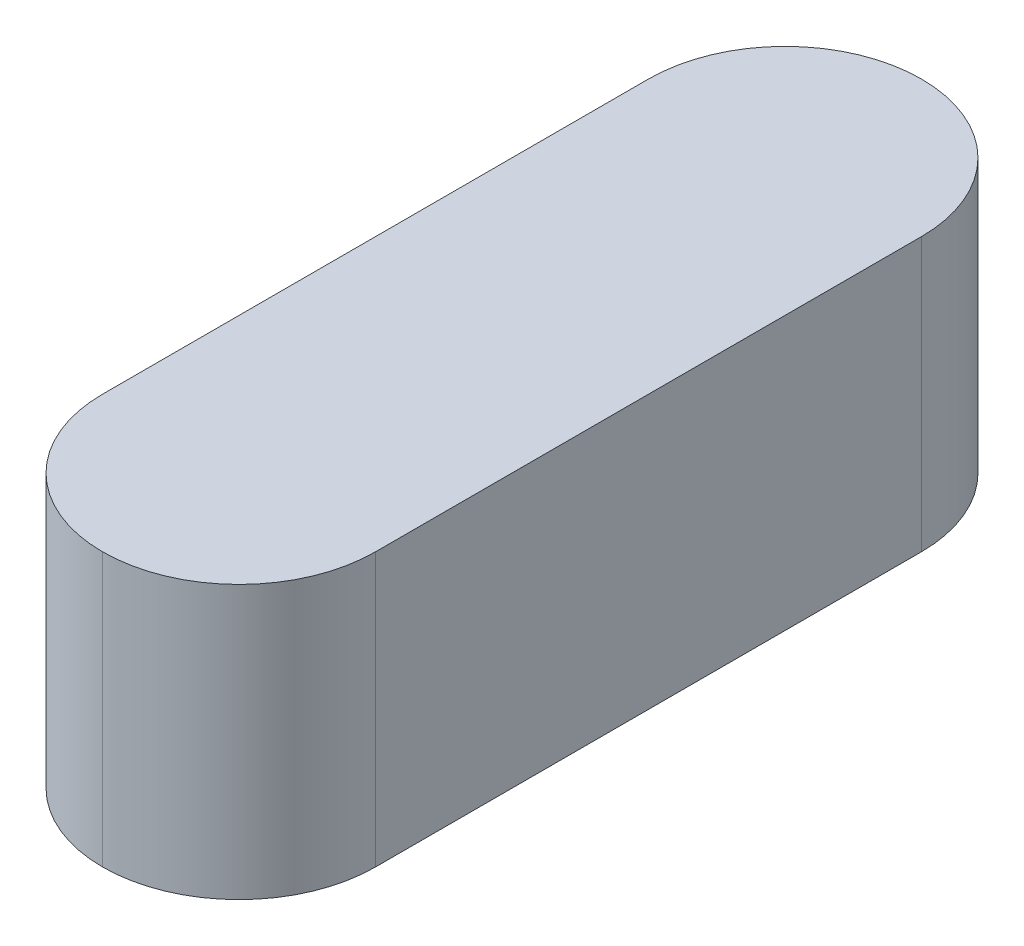
ISO-10303-21;
HEADER;
FILE_DESCRIPTION(('STEP AP214'),'2;1');
FILE_NAME('part.step','',(''),(''),'','','');
FILE_SCHEMA(('AUTOMOTIVE_DESIGN { 1 0 10303 214 1 1 1 1 }'));
ENDSEC;
DATA;
#1=APPLICATION_CONTEXT('core data for automotive mechanical design processes');
#2=APPLICATION_PROTOCOL_DEFINITION('international standard','automotive_design',2000,#1);
#3=PRODUCT_CONTEXT('',#1,'mechanical');
#4=PRODUCT('Part','Part','',(#3));
#5=PRODUCT_RELATED_PRODUCT_CATEGORY('part','',(#4));
#6=PRODUCT_DEFINITION_FORMATION('','',#4);
#7=PRODUCT_DEFINITION_CONTEXT('part definition',#1,'design');
#8=PRODUCT_DEFINITION('design','',#6,#7);
#9=PRODUCT_DEFINITION_SHAPE('','',#8);
#10=(LENGTH_UNIT() NAMED_UNIT(*) SI_UNIT(.MILLI.,.METRE.));
#11=(NAMED_UNIT(*) PLANE_ANGLE_UNIT() SI_UNIT($,.RADIAN.));
#12=(NAMED_UNIT(*) SI_UNIT($,.STERADIAN.) SOLID_ANGLE_UNIT());
#13=UNCERTAINTY_MEASURE_WITH_UNIT(LENGTH_MEASURE(1.E-05),#10,'distance_accuracy_value','');
#14=(GEOMETRIC_REPRESENTATION_CONTEXT(3) GLOBAL_UNCERTAINTY_ASSIGNED_CONTEXT((#13)) GLOBAL_UNIT_ASSIGNED_CONTEXT((#10,
#11,#12)) REPRESENTATION_CONTEXT('',''));
#15=CARTESIAN_POINT('',(0.,0.,0.));
#16=DIRECTION('',(0.,0.,1.));
#17=DIRECTION('',(1.,0.,0.));
#18=AXIS2_PLACEMENT_3D('',#15,#16,#17);
#19=CARTESIAN_POINT('',(0.,4.795,18.));
#20=DIRECTION('',(1.,0.,0.));
#21=DIRECTION('',(0.,0.,-1.));
#22=AXIS2_PLACEMENT_3D('',#19,#20,#21);
#23=PLANE('',#22);
#24=DIRECTION('',(0.,0.,-1.));
#25=VECTOR('',#24,1.);
#26=CARTESIAN_POINT('',(0.,10.795,18.));
#27=LINE('',#26,#25);
#28=CARTESIAN_POINT('',(0.,10.795,15.));
#29=VERTEX_POINT('',#28);
#30=CARTESIAN_POINT('',(0.,10.795,3.));
#31=VERTEX_POINT('',#30);
#32=EDGE_CURVE('E129',#29,#31,#27,.T.);
#33=ORIENTED_EDGE('',*,*,#32,.T.);
#34=DIRECTION('',(0.,-1.,0.));
#35=VECTOR('',#34,1.);
#36=CARTESIAN_POINT('',(0.,4.795,3.));
#37=LINE('',#36,#35);
#38=CARTESIAN_POINT('',(0.,4.795,3.));
#39=VERTEX_POINT('',#38);
#40=EDGE_CURVE('E108',#31,#39,#37,.T.);
#41=ORIENTED_EDGE('',*,*,#40,.T.);
#42=DIRECTION('',(0.,0.,-1.));
#43=VECTOR('',#42,1.);
#44=CARTESIAN_POINT('',(0.,4.795,18.));
#45=LINE('',#44,#43);
#46=CARTESIAN_POINT('',(0.,4.795,15.));
#47=VERTEX_POINT('',#46);
#48=EDGE_CURVE('E91',#47,#39,#45,.T.);
#49=ORIENTED_EDGE('',*,*,#48,.F.);
#50=DIRECTION('',(0.,-1.,0.));
#51=VECTOR('',#50,1.);
#52=CARTESIAN_POINT('',(0.,4.795,15.));
#53=LINE('',#52,#51);
#54=EDGE_CURVE('E105',#47,#29,#53,.F.);
#55=ORIENTED_EDGE('',*,*,#54,.T.);
#56=EDGE_LOOP('',(#33,#41,#49,#55));
#57=FACE_BOUND('',#56,.T.);
#58=ADVANCED_FACE('F34',(#57),#23,.F.);
#59=CARTESIAN_POINT('',(0.,4.795,18.));
#60=DIRECTION('',(0.,1.,0.));
#61=DIRECTION('',(0.,0.,1.));
#62=AXIS2_PLACEMENT_3D('',#59,#60,#61);
#63=PLANE('',#62);
#64=ORIENTED_EDGE('',*,*,#48,.T.);
#65=CARTESIAN_POINT('',(3.,4.795,3.));
#66=DIRECTION('',(0.,1.,0.));
#67=DIRECTION('',(0.,0.,1.));
#68=AXIS2_PLACEMENT_3D('',#65,#66,#67);
#69=CIRCLE('',#68,3.);
#70=CARTESIAN_POINT('',(3.,4.795,0.));
#71=VERTEX_POINT('',#70);
#72=EDGE_CURVE('E119',#39,#71,#69,.F.);
#73=ORIENTED_EDGE('',*,*,#72,.T.);
#74=CARTESIAN_POINT('',(3.,4.795,3.));
#75=DIRECTION('',(0.,1.,0.));
#76=DIRECTION('',(0.,0.,1.));
#77=AXIS2_PLACEMENT_3D('',#74,#75,#76);
#78=CIRCLE('',#77,3.);
#79=CARTESIAN_POINT('',(6.,4.795,3.));
#80=VERTEX_POINT('',#79);
#81=EDGE_CURVE('E99',#71,#80,#78,.F.);
#82=ORIENTED_EDGE('',*,*,#81,.T.);
#83=DIRECTION('',(0.,0.,-1.));
#84=VECTOR('',#83,1.);
#85=CARTESIAN_POINT('',(6.,4.795,18.));
#86=LINE('',#85,#84);
#87=CARTESIAN_POINT('',(6.,4.795,15.));
#88=VERTEX_POINT('',#87);
#89=EDGE_CURVE('E109',#88,#80,#86,.T.);
#90=ORIENTED_EDGE('',*,*,#89,.F.);
#91=CARTESIAN_POINT('',(3.,4.795,15.));
#92=DIRECTION('',(0.,1.,0.));
#93=DIRECTION('',(0.,0.,1.));
#94=AXIS2_PLACEMENT_3D('',#91,#92,#93);
#95=CIRCLE('',#94,3.);
#96=CARTESIAN_POINT('',(3.,4.795,18.));
#97=VERTEX_POINT('',#96);
#98=EDGE_CURVE('E94',#88,#97,#95,.F.);
#99=ORIENTED_EDGE('',*,*,#98,.T.);
#100=CARTESIAN_POINT('',(3.,4.795,15.));
#101=DIRECTION('',(0.,1.,0.));
#102=DIRECTION('',(0.,0.,1.));
#103=AXIS2_PLACEMENT_3D('',#100,#101,#102);
#104=CIRCLE('',#103,3.);
#105=EDGE_CURVE('E88',#97,#47,#104,.F.);
#106=ORIENTED_EDGE('',*,*,#105,.T.);
#107=EDGE_LOOP('',(#64,#73,#82,#90,#99,#106));
#108=FACE_BOUND('',#107,.T.);
#109=ADVANCED_FACE('F90',(#108),#63,.F.);
#110=CARTESIAN_POINT('',(6.,4.795,18.));
#111=DIRECTION('',(-1.,0.,0.));
#112=DIRECTION('',(0.,0.,1.));
#113=AXIS2_PLACEMENT_3D('',#110,#111,#112);
#114=PLANE('',#113);
#115=ORIENTED_EDGE('',*,*,#89,.T.);
#116=DIRECTION('',(0.,1.,0.));
#117=VECTOR('',#116,1.);
#118=CARTESIAN_POINT('',(6.,10.795,3.));
#119=LINE('',#118,#117);
#120=CARTESIAN_POINT('',(6.,10.795,3.));
#121=VERTEX_POINT('',#120);
#122=EDGE_CURVE('E11',#80,#121,#119,.T.);
#123=ORIENTED_EDGE('',*,*,#122,.T.);
#124=DIRECTION('',(0.,0.,-1.));
#125=VECTOR('',#124,1.);
#126=CARTESIAN_POINT('',(6.,10.795,18.));
#127=LINE('',#126,#125);
#128=CARTESIAN_POINT('',(6.,10.795,15.));
#129=VERTEX_POINT('',#128);
#130=EDGE_CURVE('E133',#129,#121,#127,.T.);
#131=ORIENTED_EDGE('',*,*,#130,.F.);
#132=DIRECTION('',(0.,1.,0.));
#133=VECTOR('',#132,1.);
#134=CARTESIAN_POINT('',(6.,4.795,15.));
#135=LINE('',#134,#133);
#136=EDGE_CURVE('E43',#129,#88,#135,.F.);
#137=ORIENTED_EDGE('',*,*,#136,.T.);
#138=EDGE_LOOP('',(#115,#123,#131,#137));
#139=FACE_BOUND('',#138,.T.);
#140=ADVANCED_FACE('F137',(#139),#114,.F.);
#141=CARTESIAN_POINT('',(0.,10.795,18.));
#142=DIRECTION('',(0.,-1.,0.));
#143=DIRECTION('',(0.,0.,-1.));
#144=AXIS2_PLACEMENT_3D('',#141,#142,#143);
#145=PLANE('',#144);
#146=CARTESIAN_POINT('',(3.,10.795,3.));
#147=DIRECTION('',(0.,-1.,0.));
#148=DIRECTION('',(0.,0.,-1.));
#149=AXIS2_PLACEMENT_3D('',#146,#147,#148);
#150=CIRCLE('',#149,3.);
#151=CARTESIAN_POINT('',(3.,10.795,0.));
#152=VERTEX_POINT('',#151);
#153=EDGE_CURVE('E123',#121,#152,#150,.F.);
#154=ORIENTED_EDGE('',*,*,#153,.T.);
#155=CARTESIAN_POINT('',(3.,10.795,3.));
#156=DIRECTION('',(0.,-1.,0.));
#157=DIRECTION('',(0.,0.,-1.));
#158=AXIS2_PLACEMENT_3D('',#155,#156,#157);
#159=CIRCLE('',#158,3.);
#160=EDGE_CURVE('E125',#152,#31,#159,.F.);
#161=ORIENTED_EDGE('',*,*,#160,.T.);
#162=ORIENTED_EDGE('',*,*,#32,.F.);
#163=CARTESIAN_POINT('',(3.,10.795,15.));
#164=DIRECTION('',(0.,-1.,0.));
#165=DIRECTION('',(0.,0.,-1.));
#166=AXIS2_PLACEMENT_3D('',#163,#164,#165);
#167=CIRCLE('',#166,3.);
#168=CARTESIAN_POINT('',(3.,10.795,18.));
#169=VERTEX_POINT('',#168);
#170=EDGE_CURVE('E112',#29,#169,#167,.F.);
#171=ORIENTED_EDGE('',*,*,#170,.T.);
#172=CARTESIAN_POINT('',(3.,10.795,15.));
#173=DIRECTION('',(0.,-1.,0.));
#174=DIRECTION('',(0.,0.,-1.));
#175=AXIS2_PLACEMENT_3D('',#172,#173,#174);
#176=CIRCLE('',#175,3.);
#177=EDGE_CURVE('E56',#169,#129,#176,.F.);
#178=ORIENTED_EDGE('',*,*,#177,.T.);
#179=ORIENTED_EDGE('',*,*,#130,.T.);
#180=EDGE_LOOP('',(#154,#161,#162,#171,#178,#179));
#181=FACE_BOUND('',#180,.T.);
#182=ADVANCED_FACE('F141',(#181),#145,.F.);
#183=CARTESIAN_POINT('',(3.,4.795,3.));
#184=DIRECTION('',(0.,-1.,0.));
#185=DIRECTION('',(0.,0.,-1.));
#186=AXIS2_PLACEMENT_3D('',#183,#184,#185);
#187=CYLINDRICAL_SURFACE('',#186,3.);
#188=DIRECTION('',(0.,1.,0.));
#189=VECTOR('',#188,1.);
#190=CARTESIAN_POINT('',(3.,4.795,0.));
#191=LINE('',#190,#189);
#192=EDGE_CURVE('E127',#152,#71,#191,.F.);
#193=ORIENTED_EDGE('',*,*,#192,.F.);
#194=ORIENTED_EDGE('',*,*,#153,.F.);
#195=ORIENTED_EDGE('',*,*,#122,.F.);
#196=ORIENTED_EDGE('',*,*,#81,.F.);
#197=EDGE_LOOP('',(#193,#194,#195,#196));
#198=FACE_BOUND('',#197,.T.);
#199=ADVANCED_FACE('F143',(#198),#187,.T.);
#200=CARTESIAN_POINT('',(3.,4.795,3.));
#201=DIRECTION('',(0.,1.,0.));
#202=DIRECTION('',(0.,0.,1.));
#203=AXIS2_PLACEMENT_3D('',#200,#201,#202);
#204=CYLINDRICAL_SURFACE('',#203,3.);
#205=ORIENTED_EDGE('',*,*,#160,.F.);
#206=ORIENTED_EDGE('',*,*,#192,.T.);
#207=ORIENTED_EDGE('',*,*,#72,.F.);
#208=ORIENTED_EDGE('',*,*,#40,.F.);
#209=EDGE_LOOP('',(#205,#206,#207,#208));
#210=FACE_BOUND('',#209,.T.);
#211=ADVANCED_FACE('F144',(#210),#204,.T.);
#212=CARTESIAN_POINT('',(3.,10.795,15.));
#213=DIRECTION('',(0.,1.,0.));
#214=DIRECTION('',(0.,0.,1.));
#215=AXIS2_PLACEMENT_3D('',#212,#213,#214);
#216=CYLINDRICAL_SURFACE('',#215,3.);
#217=ORIENTED_EDGE('',*,*,#136,.F.);
#218=ORIENTED_EDGE('',*,*,#177,.F.);
#219=DIRECTION('',(0.,1.,0.));
#220=VECTOR('',#219,1.);
#221=CARTESIAN_POINT('',(3.,10.795,18.));
#222=LINE('',#221,#220);
#223=EDGE_CURVE('E38',#97,#169,#222,.T.);
#224=ORIENTED_EDGE('',*,*,#223,.F.);
#225=ORIENTED_EDGE('',*,*,#98,.F.);
#226=EDGE_LOOP('',(#217,#218,#224,#225));
#227=FACE_BOUND('',#226,.T.);
#228=ADVANCED_FACE('F36',(#227),#216,.T.);
#229=CARTESIAN_POINT('',(3.,10.795,15.));
#230=DIRECTION('',(0.,-1.,0.));
#231=DIRECTION('',(0.,0.,-1.));
#232=AXIS2_PLACEMENT_3D('',#229,#230,#231);
#233=CYLINDRICAL_SURFACE('',#232,3.);
#234=ORIENTED_EDGE('',*,*,#170,.F.);
#235=ORIENTED_EDGE('',*,*,#54,.F.);
#236=ORIENTED_EDGE('',*,*,#105,.F.);
#237=ORIENTED_EDGE('',*,*,#223,.T.);
#238=EDGE_LOOP('',(#234,#235,#236,#237));
#239=FACE_BOUND('',#238,.T.);
#240=ADVANCED_FACE('F111',(#239),#233,.T.);
#241=CLOSED_SHELL('',(#58,#109,#140,#182,#199,#211,#228,#240));
#242=MANIFOLD_SOLID_BREP('B2',#241);
#243=ADVANCED_BREP_SHAPE_REPRESENTATION('',(#18,#242),#14);
#244=SHAPE_DEFINITION_REPRESENTATION(#9,#243);
ENDSEC;
END-ISO-10303-21;
